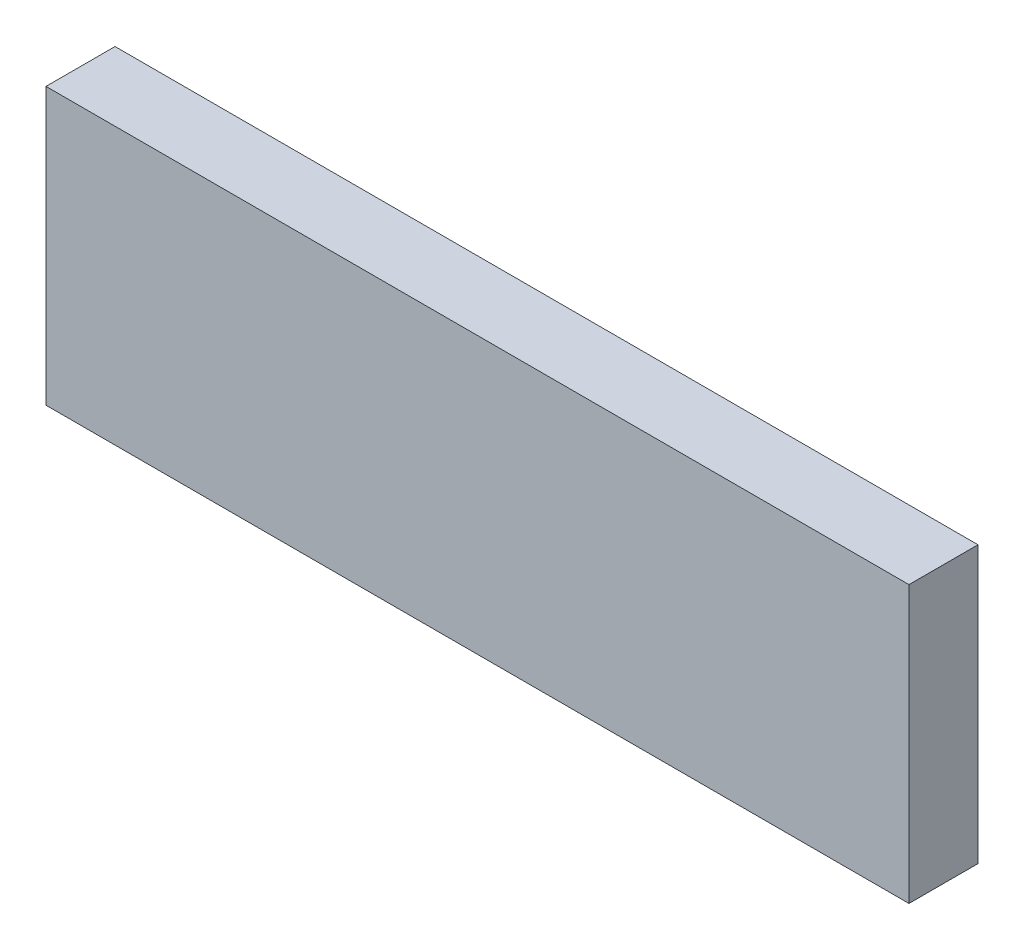
ISO-10303-21;
HEADER;
FILE_DESCRIPTION(('STEP AP214'),'2;1');
FILE_NAME('part.step','',(''),(''),'','','');
FILE_SCHEMA(('AUTOMOTIVE_DESIGN { 1 0 10303 214 1 1 1 1 }'));
ENDSEC;
DATA;
#1=APPLICATION_CONTEXT('core data for automotive mechanical design processes');
#2=APPLICATION_PROTOCOL_DEFINITION('international standard','automotive_design',2000,#1);
#3=PRODUCT_CONTEXT('',#1,'mechanical');
#4=PRODUCT('Part','Part','',(#3));
#5=PRODUCT_RELATED_PRODUCT_CATEGORY('part','',(#4));
#6=PRODUCT_DEFINITION_FORMATION('','',#4);
#7=PRODUCT_DEFINITION_CONTEXT('part definition',#1,'design');
#8=PRODUCT_DEFINITION('design','',#6,#7);
#9=PRODUCT_DEFINITION_SHAPE('','',#8);
#10=(LENGTH_UNIT() NAMED_UNIT(*) SI_UNIT(.MILLI.,.METRE.));
#11=(NAMED_UNIT(*) PLANE_ANGLE_UNIT() SI_UNIT($,.RADIAN.));
#12=(NAMED_UNIT(*) SI_UNIT($,.STERADIAN.) SOLID_ANGLE_UNIT());
#13=UNCERTAINTY_MEASURE_WITH_UNIT(LENGTH_MEASURE(1.E-05),#10,'distance_accuracy_value','');
#14=(GEOMETRIC_REPRESENTATION_CONTEXT(3) GLOBAL_UNCERTAINTY_ASSIGNED_CONTEXT((#13)) GLOBAL_UNIT_ASSIGNED_CONTEXT((#10,
#11,#12)) REPRESENTATION_CONTEXT('',''));
#15=CARTESIAN_POINT('',(0.,0.,0.));
#16=DIRECTION('',(0.,0.,1.));
#17=DIRECTION('',(1.,0.,0.));
#18=AXIS2_PLACEMENT_3D('',#15,#16,#17);
#19=CARTESIAN_POINT('',(15.875,-5.08,2.54));
#20=DIRECTION('',(-1.,0.,0.));
#21=DIRECTION('',(0.,0.,1.));
#22=AXIS2_PLACEMENT_3D('',#19,#20,#21);
#23=PLANE('',#22);
#24=DIRECTION('',(0.,1.,0.));
#25=VECTOR('',#24,1.);
#26=CARTESIAN_POINT('',(15.875,-5.08,0.));
#27=LINE('',#26,#25);
#28=CARTESIAN_POINT('',(15.875,-5.08,0.));
#29=VERTEX_POINT('',#28);
#30=CARTESIAN_POINT('',(15.875,5.08,0.));
#31=VERTEX_POINT('',#30);
#32=EDGE_CURVE('E107',#29,#31,#27,.T.);
#33=ORIENTED_EDGE('',*,*,#32,.T.);
#34=DIRECTION('',(0.,0.,-1.));
#35=VECTOR('',#34,1.);
#36=CARTESIAN_POINT('',(15.875,5.08,2.54));
#37=LINE('',#36,#35);
#38=CARTESIAN_POINT('',(15.875,5.08,2.54));
#39=VERTEX_POINT('',#38);
#40=EDGE_CURVE('E11',#39,#31,#37,.T.);
#41=ORIENTED_EDGE('',*,*,#40,.F.);
#42=DIRECTION('',(0.,1.,0.));
#43=VECTOR('',#42,1.);
#44=CARTESIAN_POINT('',(15.875,-5.08,2.54));
#45=LINE('',#44,#43);
#46=CARTESIAN_POINT('',(15.875,-5.08,2.54));
#47=VERTEX_POINT('',#46);
#48=EDGE_CURVE('E92',#47,#39,#45,.T.);
#49=ORIENTED_EDGE('',*,*,#48,.F.);
#50=DIRECTION('',(0.,0.,-1.));
#51=VECTOR('',#50,1.);
#52=CARTESIAN_POINT('',(15.875,-5.08,2.54));
#53=LINE('',#52,#51);
#54=EDGE_CURVE('E105',#47,#29,#53,.T.);
#55=ORIENTED_EDGE('',*,*,#54,.T.);
#56=EDGE_LOOP('',(#33,#41,#49,#55));
#57=FACE_BOUND('',#56,.T.);
#58=ADVANCED_FACE('F43',(#57),#23,.F.);
#59=CARTESIAN_POINT('',(-15.875,5.08,2.54));
#60=DIRECTION('',(0.,-1.,0.));
#61=DIRECTION('',(0.,0.,-1.));
#62=AXIS2_PLACEMENT_3D('',#59,#60,#61);
#63=PLANE('',#62);
#64=DIRECTION('',(-1.,0.,0.));
#65=VECTOR('',#64,1.);
#66=CARTESIAN_POINT('',(-15.875,5.08,0.));
#67=LINE('',#66,#65);
#68=CARTESIAN_POINT('',(-15.875,5.08,0.));
#69=VERTEX_POINT('',#68);
#70=EDGE_CURVE('E97',#31,#69,#67,.T.);
#71=ORIENTED_EDGE('',*,*,#70,.T.);
#72=DIRECTION('',(0.,0.,-1.));
#73=VECTOR('',#72,1.);
#74=CARTESIAN_POINT('',(-15.875,5.08,2.54));
#75=LINE('',#74,#73);
#76=CARTESIAN_POINT('',(-15.875,5.08,2.54));
#77=VERTEX_POINT('',#76);
#78=EDGE_CURVE('E51',#77,#69,#75,.T.);
#79=ORIENTED_EDGE('',*,*,#78,.F.);
#80=DIRECTION('',(-1.,0.,0.));
#81=VECTOR('',#80,1.);
#82=CARTESIAN_POINT('',(-15.875,5.08,2.54));
#83=LINE('',#82,#81);
#84=EDGE_CURVE('E87',#39,#77,#83,.T.);
#85=ORIENTED_EDGE('',*,*,#84,.F.);
#86=ORIENTED_EDGE('',*,*,#40,.T.);
#87=EDGE_LOOP('',(#71,#79,#85,#86));
#88=FACE_BOUND('',#87,.T.);
#89=ADVANCED_FACE('F100',(#88),#63,.F.);
#90=CARTESIAN_POINT('',(-15.875,-5.08,2.54));
#91=DIRECTION('',(1.,0.,0.));
#92=DIRECTION('',(0.,0.,-1.));
#93=AXIS2_PLACEMENT_3D('',#90,#91,#92);
#94=PLANE('',#93);
#95=DIRECTION('',(0.,-1.,0.));
#96=VECTOR('',#95,1.);
#97=CARTESIAN_POINT('',(-15.875,-5.08,0.));
#98=LINE('',#97,#96);
#99=CARTESIAN_POINT('',(-15.875,-5.08,0.));
#100=VERTEX_POINT('',#99);
#101=EDGE_CURVE('E78',#69,#100,#98,.T.);
#102=ORIENTED_EDGE('',*,*,#101,.T.);
#103=DIRECTION('',(0.,0.,-1.));
#104=VECTOR('',#103,1.);
#105=CARTESIAN_POINT('',(-15.875,-5.08,2.54));
#106=LINE('',#105,#104);
#107=CARTESIAN_POINT('',(-15.875,-5.08,2.54));
#108=VERTEX_POINT('',#107);
#109=EDGE_CURVE('E98',#108,#100,#106,.T.);
#110=ORIENTED_EDGE('',*,*,#109,.F.);
#111=DIRECTION('',(0.,-1.,0.));
#112=VECTOR('',#111,1.);
#113=CARTESIAN_POINT('',(-15.875,-5.08,2.54));
#114=LINE('',#113,#112);
#115=EDGE_CURVE('E95',#77,#108,#114,.T.);
#116=ORIENTED_EDGE('',*,*,#115,.F.);
#117=ORIENTED_EDGE('',*,*,#78,.T.);
#118=EDGE_LOOP('',(#102,#110,#116,#117));
#119=FACE_BOUND('',#118,.T.);
#120=ADVANCED_FACE('F99',(#119),#94,.F.);
#121=CARTESIAN_POINT('',(-15.875,-5.08,2.54));
#122=DIRECTION('',(0.,1.,0.));
#123=DIRECTION('',(0.,0.,1.));
#124=AXIS2_PLACEMENT_3D('',#121,#122,#123);
#125=PLANE('',#124);
#126=DIRECTION('',(1.,0.,0.));
#127=VECTOR('',#126,1.);
#128=CARTESIAN_POINT('',(-15.875,-5.08,0.));
#129=LINE('',#128,#127);
#130=EDGE_CURVE('E85',#100,#29,#129,.T.);
#131=ORIENTED_EDGE('',*,*,#130,.T.);
#132=ORIENTED_EDGE('',*,*,#54,.F.);
#133=DIRECTION('',(1.,0.,0.));
#134=VECTOR('',#133,1.);
#135=CARTESIAN_POINT('',(-15.875,-5.08,2.54));
#136=LINE('',#135,#134);
#137=EDGE_CURVE('E56',#108,#47,#136,.T.);
#138=ORIENTED_EDGE('',*,*,#137,.F.);
#139=ORIENTED_EDGE('',*,*,#109,.T.);
#140=EDGE_LOOP('',(#131,#132,#138,#139));
#141=FACE_BOUND('',#140,.T.);
#142=ADVANCED_FACE('F111',(#141),#125,.F.);
#143=CARTESIAN_POINT('',(0.,0.,2.54));
#144=DIRECTION('',(0.,0.,-1.));
#145=DIRECTION('',(-1.,0.,0.));
#146=AXIS2_PLACEMENT_3D('',#143,#144,#145);
#147=PLANE('',#146);
#148=ORIENTED_EDGE('',*,*,#48,.T.);
#149=ORIENTED_EDGE('',*,*,#84,.T.);
#150=ORIENTED_EDGE('',*,*,#115,.T.);
#151=ORIENTED_EDGE('',*,*,#137,.T.);
#152=EDGE_LOOP('',(#148,#149,#150,#151));
#153=FACE_BOUND('',#152,.T.);
#154=ADVANCED_FACE('F89',(#153),#147,.F.);
#155=CARTESIAN_POINT('',(0.,0.,0.));
#156=DIRECTION('',(0.,0.,-1.));
#157=DIRECTION('',(-1.,0.,0.));
#158=AXIS2_PLACEMENT_3D('',#155,#156,#157);
#159=PLANE('',#158);
#160=ORIENTED_EDGE('',*,*,#32,.F.);
#161=ORIENTED_EDGE('',*,*,#130,.F.);
#162=ORIENTED_EDGE('',*,*,#101,.F.);
#163=ORIENTED_EDGE('',*,*,#70,.F.);
#164=EDGE_LOOP('',(#160,#161,#162,#163));
#165=FACE_BOUND('',#164,.T.);
#166=ADVANCED_FACE('F117',(#165),#159,.T.);
#167=CLOSED_SHELL('',(#58,#89,#120,#142,#154,#166));
#168=MANIFOLD_SOLID_BREP('B2',#167);
#169=ADVANCED_BREP_SHAPE_REPRESENTATION('',(#18,#168),#14);
#170=SHAPE_DEFINITION_REPRESENTATION(#9,#169);
ENDSEC;
END-ISO-10303-21;
